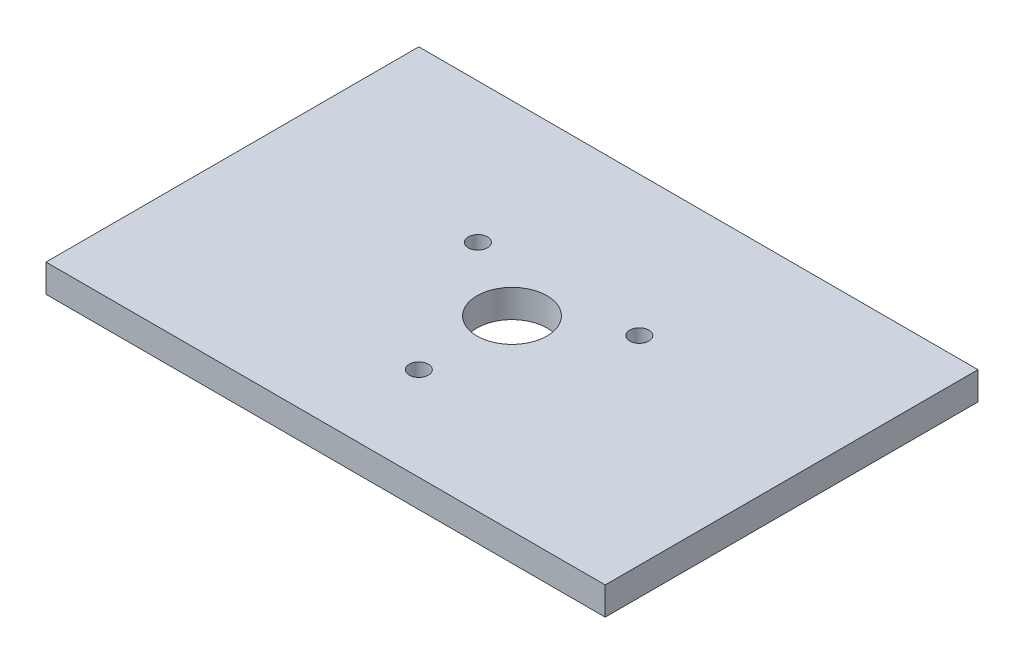
ISO-10303-21;
HEADER;
FILE_DESCRIPTION(('STEP AP214'),'2;1');
FILE_NAME('part.step','',(''),(''),'','','');
FILE_SCHEMA(('AUTOMOTIVE_DESIGN { 1 0 10303 214 1 1 1 1 }'));
ENDSEC;
DATA;
#1=APPLICATION_CONTEXT('core data for automotive mechanical design processes');
#2=APPLICATION_PROTOCOL_DEFINITION('international standard','automotive_design',2000,#1);
#3=PRODUCT_CONTEXT('',#1,'mechanical');
#4=PRODUCT('Part','Part','',(#3));
#5=PRODUCT_RELATED_PRODUCT_CATEGORY('part','',(#4));
#6=PRODUCT_DEFINITION_FORMATION('','',#4);
#7=PRODUCT_DEFINITION_CONTEXT('part definition',#1,'design');
#8=PRODUCT_DEFINITION('design','',#6,#7);
#9=PRODUCT_DEFINITION_SHAPE('','',#8);
#10=(LENGTH_UNIT() NAMED_UNIT(*) SI_UNIT(.MILLI.,.METRE.));
#11=(NAMED_UNIT(*) PLANE_ANGLE_UNIT() SI_UNIT($,.RADIAN.));
#12=(NAMED_UNIT(*) SI_UNIT($,.STERADIAN.) SOLID_ANGLE_UNIT());
#13=UNCERTAINTY_MEASURE_WITH_UNIT(LENGTH_MEASURE(1.E-05),#10,'distance_accuracy_value','');
#14=(GEOMETRIC_REPRESENTATION_CONTEXT(3) GLOBAL_UNCERTAINTY_ASSIGNED_CONTEXT((#13)) GLOBAL_UNIT_ASSIGNED_CONTEXT((#10,
#11,#12)) REPRESENTATION_CONTEXT('',''));
#15=CARTESIAN_POINT('',(0.,0.,0.));
#16=DIRECTION('',(0.,0.,1.));
#17=DIRECTION('',(1.,0.,0.));
#18=AXIS2_PLACEMENT_3D('',#15,#16,#17);
#19=CARTESIAN_POINT('',(60.,6.,-40.));
#20=DIRECTION('',(-1.,0.,0.));
#21=DIRECTION('',(0.,0.,1.));
#22=AXIS2_PLACEMENT_3D('',#19,#20,#21);
#23=PLANE('',#22);
#24=DIRECTION('',(0.,0.,-1.));
#25=VECTOR('',#24,1.);
#26=CARTESIAN_POINT('',(60.,0.,-40.));
#27=LINE('',#26,#25);
#28=CARTESIAN_POINT('',(60.,0.,40.));
#29=VERTEX_POINT('',#28);
#30=CARTESIAN_POINT('',(60.,0.,-40.));
#31=VERTEX_POINT('',#30);
#32=EDGE_CURVE('E101',#29,#31,#27,.T.);
#33=ORIENTED_EDGE('',*,*,#32,.T.);
#34=DIRECTION('',(0.,-1.,0.));
#35=VECTOR('',#34,1.);
#36=CARTESIAN_POINT('',(60.,6.,-40.));
#37=LINE('',#36,#35);
#38=CARTESIAN_POINT('',(60.,6.,-40.));
#39=VERTEX_POINT('',#38);
#40=EDGE_CURVE('E11',#39,#31,#37,.T.);
#41=ORIENTED_EDGE('',*,*,#40,.F.);
#42=DIRECTION('',(0.,0.,-1.));
#43=VECTOR('',#42,1.);
#44=CARTESIAN_POINT('',(60.,6.,-40.));
#45=LINE('',#44,#43);
#46=CARTESIAN_POINT('',(60.,6.,40.));
#47=VERTEX_POINT('',#46);
#48=EDGE_CURVE('E88',#47,#39,#45,.T.);
#49=ORIENTED_EDGE('',*,*,#48,.F.);
#50=DIRECTION('',(0.,-1.,0.));
#51=VECTOR('',#50,1.);
#52=CARTESIAN_POINT('',(60.,6.,40.));
#53=LINE('',#52,#51);
#54=EDGE_CURVE('E97',#47,#29,#53,.T.);
#55=ORIENTED_EDGE('',*,*,#54,.T.);
#56=EDGE_LOOP('',(#33,#41,#49,#55));
#57=FACE_BOUND('',#56,.T.);
#58=ADVANCED_FACE('F35',(#57),#23,.F.);
#59=CARTESIAN_POINT('',(-60.,6.,-40.));
#60=DIRECTION('',(0.,0.,1.));
#61=DIRECTION('',(1.,0.,0.));
#62=AXIS2_PLACEMENT_3D('',#59,#60,#61);
#63=PLANE('',#62);
#64=DIRECTION('',(-1.,0.,0.));
#65=VECTOR('',#64,1.);
#66=CARTESIAN_POINT('',(-60.,0.,-40.));
#67=LINE('',#66,#65);
#68=CARTESIAN_POINT('',(-60.,0.,-40.));
#69=VERTEX_POINT('',#68);
#70=EDGE_CURVE('E92',#31,#69,#67,.T.);
#71=ORIENTED_EDGE('',*,*,#70,.T.);
#72=DIRECTION('',(0.,-1.,0.));
#73=VECTOR('',#72,1.);
#74=CARTESIAN_POINT('',(-60.,6.,-40.));
#75=LINE('',#74,#73);
#76=CARTESIAN_POINT('',(-60.,6.,-40.));
#77=VERTEX_POINT('',#76);
#78=EDGE_CURVE('E44',#77,#69,#75,.T.);
#79=ORIENTED_EDGE('',*,*,#78,.F.);
#80=DIRECTION('',(-1.,0.,0.));
#81=VECTOR('',#80,1.);
#82=CARTESIAN_POINT('',(-60.,6.,-40.));
#83=LINE('',#82,#81);
#84=EDGE_CURVE('E83',#39,#77,#83,.T.);
#85=ORIENTED_EDGE('',*,*,#84,.F.);
#86=ORIENTED_EDGE('',*,*,#40,.T.);
#87=EDGE_LOOP('',(#71,#79,#85,#86));
#88=FACE_BOUND('',#87,.T.);
#89=ADVANCED_FACE('F91',(#88),#63,.F.);
#90=CARTESIAN_POINT('',(-60.,6.,-40.));
#91=DIRECTION('',(1.,0.,0.));
#92=DIRECTION('',(0.,0.,-1.));
#93=AXIS2_PLACEMENT_3D('',#90,#91,#92);
#94=PLANE('',#93);
#95=DIRECTION('',(0.,0.,1.));
#96=VECTOR('',#95,1.);
#97=CARTESIAN_POINT('',(-60.,0.,-40.));
#98=LINE('',#97,#96);
#99=CARTESIAN_POINT('',(-60.,0.,40.));
#100=VERTEX_POINT('',#99);
#101=EDGE_CURVE('E70',#69,#100,#98,.T.);
#102=ORIENTED_EDGE('',*,*,#101,.T.);
#103=DIRECTION('',(0.,-1.,0.));
#104=VECTOR('',#103,1.);
#105=CARTESIAN_POINT('',(-60.,6.,40.));
#106=LINE('',#105,#104);
#107=CARTESIAN_POINT('',(-60.,6.,40.));
#108=VERTEX_POINT('',#107);
#109=EDGE_CURVE('E93',#108,#100,#106,.T.);
#110=ORIENTED_EDGE('',*,*,#109,.F.);
#111=DIRECTION('',(0.,0.,1.));
#112=VECTOR('',#111,1.);
#113=CARTESIAN_POINT('',(-60.,6.,-40.));
#114=LINE('',#113,#112);
#115=EDGE_CURVE('E86',#77,#108,#114,.T.);
#116=ORIENTED_EDGE('',*,*,#115,.F.);
#117=ORIENTED_EDGE('',*,*,#78,.T.);
#118=EDGE_LOOP('',(#102,#110,#116,#117));
#119=FACE_BOUND('',#118,.T.);
#120=ADVANCED_FACE('F95',(#119),#94,.F.);
#121=CARTESIAN_POINT('',(-60.,6.,40.));
#122=DIRECTION('',(0.,0.,-1.));
#123=DIRECTION('',(-1.,0.,0.));
#124=AXIS2_PLACEMENT_3D('',#121,#122,#123);
#125=PLANE('',#124);
#126=DIRECTION('',(1.,0.,0.));
#127=VECTOR('',#126,1.);
#128=CARTESIAN_POINT('',(-60.,0.,40.));
#129=LINE('',#128,#127);
#130=EDGE_CURVE('E76',#100,#29,#129,.T.);
#131=ORIENTED_EDGE('',*,*,#130,.T.);
#132=ORIENTED_EDGE('',*,*,#54,.F.);
#133=DIRECTION('',(1.,0.,0.));
#134=VECTOR('',#133,1.);
#135=CARTESIAN_POINT('',(-60.,6.,40.));
#136=LINE('',#135,#134);
#137=EDGE_CURVE('E53',#108,#47,#136,.T.);
#138=ORIENTED_EDGE('',*,*,#137,.F.);
#139=ORIENTED_EDGE('',*,*,#109,.T.);
#140=EDGE_LOOP('',(#131,#132,#138,#139));
#141=FACE_BOUND('',#140,.T.);
#142=ADVANCED_FACE('F165',(#141),#125,.F.);
#143=CARTESIAN_POINT('',(0.,6.,0.));
#144=DIRECTION('',(0.,1.,0.));
#145=DIRECTION('',(0.,0.,1.));
#146=AXIS2_PLACEMENT_3D('',#143,#144,#145);
#147=PLANE('',#146);
#148=CARTESIAN_POINT('',(0.,6.,0.));
#149=DIRECTION('',(0.,1.,0.));
#150=DIRECTION('',(0.,0.,1.));
#151=AXIS2_PLACEMENT_3D('',#148,#149,#150);
#152=CIRCLE('',#151,7.5);
#153=CARTESIAN_POINT('',(0.,6.,7.5));
#154=VERTEX_POINT('',#153);
#155=EDGE_CURVE('E398',#154,#154,#152,.T.);
#156=ORIENTED_EDGE('',*,*,#155,.F.);
#157=EDGE_LOOP('',(#156));
#158=FACE_BOUND('',#157,.T.);
#159=CARTESIAN_POINT('',(17.3205080756889,6.,-9.99999999999984));
#160=DIRECTION('',(0.,1.,0.));
#161=DIRECTION('',(0.,0.,1.));
#162=AXIS2_PLACEMENT_3D('',#159,#160,#161);
#163=CIRCLE('',#162,2.05);
#164=CARTESIAN_POINT('',(17.3205080756889,6.,-7.94999999999984));
#165=VERTEX_POINT('',#164);
#166=EDGE_CURVE('E143',#165,#165,#163,.T.);
#167=ORIENTED_EDGE('',*,*,#166,.F.);
#168=EDGE_LOOP('',(#167));
#169=FACE_BOUND('',#168,.T.);
#170=CARTESIAN_POINT('',(-17.3205080756887,6.,-10.0000000000001));
#171=DIRECTION('',(0.,1.,0.));
#172=DIRECTION('',(0.,0.,1.));
#173=AXIS2_PLACEMENT_3D('',#170,#171,#172);
#174=CIRCLE('',#173,2.05);
#175=CARTESIAN_POINT('',(-17.3205080756887,6.,-7.95000000000008));
#176=VERTEX_POINT('',#175);
#177=EDGE_CURVE('E147',#176,#176,#174,.T.);
#178=ORIENTED_EDGE('',*,*,#177,.F.);
#179=EDGE_LOOP('',(#178));
#180=FACE_BOUND('',#179,.T.);
#181=CARTESIAN_POINT('',(0.,6.,20.));
#182=DIRECTION('',(0.,1.,0.));
#183=DIRECTION('',(0.,0.,1.));
#184=AXIS2_PLACEMENT_3D('',#181,#182,#183);
#185=CIRCLE('',#184,2.05);
#186=CARTESIAN_POINT('',(0.,6.,22.05));
#187=VERTEX_POINT('',#186);
#188=EDGE_CURVE('E153',#187,#187,#185,.T.);
#189=ORIENTED_EDGE('',*,*,#188,.F.);
#190=EDGE_LOOP('',(#189));
#191=FACE_BOUND('',#190,.T.);
#192=ORIENTED_EDGE('',*,*,#48,.T.);
#193=ORIENTED_EDGE('',*,*,#84,.T.);
#194=ORIENTED_EDGE('',*,*,#115,.T.);
#195=ORIENTED_EDGE('',*,*,#137,.T.);
#196=EDGE_LOOP('',(#192,#193,#194,#195));
#197=FACE_BOUND('',#196,.T.);
#198=ADVANCED_FACE('F84',(#158,#169,#180,#191,#197),#147,.T.);
#199=CARTESIAN_POINT('',(0.,0.,0.));
#200=DIRECTION('',(0.,1.,0.));
#201=DIRECTION('',(0.,0.,1.));
#202=AXIS2_PLACEMENT_3D('',#199,#200,#201);
#203=PLANE('',#202);
#204=CARTESIAN_POINT('',(0.,0.,0.));
#205=DIRECTION('',(0.,-1.,0.));
#206=DIRECTION('',(0.,0.,-1.));
#207=AXIS2_PLACEMENT_3D('',#204,#205,#206);
#208=CIRCLE('',#207,7.5);
#209=CARTESIAN_POINT('',(0.,0.,-7.5));
#210=VERTEX_POINT('',#209);
#211=EDGE_CURVE('E401',#210,#210,#208,.T.);
#212=ORIENTED_EDGE('',*,*,#211,.F.);
#213=EDGE_LOOP('',(#212));
#214=FACE_BOUND('',#213,.T.);
#215=CARTESIAN_POINT('',(1.23317027271744E-12,0.,-18.9999999999993));
#216=DIRECTION('',(0.,-1.,0.));
#217=DIRECTION('',(0.,0.,-1.));
#218=AXIS2_PLACEMENT_3D('',#215,#216,#217);
#219=CIRCLE('',#218,4.00000000000055);
#220=CARTESIAN_POINT('',(1.23317027271744E-12,0.,-22.9999999999999));
#221=VERTEX_POINT('',#220);
#222=EDGE_CURVE('E130',#221,#221,#219,.T.);
#223=ORIENTED_EDGE('',*,*,#222,.F.);
#224=EDGE_LOOP('',(#223));
#225=FACE_BOUND('',#224,.T.);
#226=CARTESIAN_POINT('',(16.4544826719043,0.,9.50000000000142));
#227=DIRECTION('',(0.,-1.,0.));
#228=DIRECTION('',(0.,0.,-1.));
#229=AXIS2_PLACEMENT_3D('',#226,#227,#228);
#230=CIRCLE('',#229,4.00000000000143);
#231=CARTESIAN_POINT('',(16.4544826719043,0.,5.49999999999998));
#232=VERTEX_POINT('',#231);
#233=EDGE_CURVE('E123',#232,#232,#230,.T.);
#234=ORIENTED_EDGE('',*,*,#233,.F.);
#235=EDGE_LOOP('',(#234));
#236=FACE_BOUND('',#235,.T.);
#237=CARTESIAN_POINT('',(-16.4544826719043,0.,9.49999999999999));
#238=DIRECTION('',(0.,-1.,0.));
#239=DIRECTION('',(0.,0.,-1.));
#240=AXIS2_PLACEMENT_3D('',#237,#238,#239);
#241=CIRCLE('',#240,4.);
#242=CARTESIAN_POINT('',(-16.4544826719043,0.,5.49999999999999));
#243=VERTEX_POINT('',#242);
#244=EDGE_CURVE('E116',#243,#243,#241,.T.);
#245=ORIENTED_EDGE('',*,*,#244,.F.);
#246=EDGE_LOOP('',(#245));
#247=FACE_BOUND('',#246,.T.);
#248=ORIENTED_EDGE('',*,*,#32,.F.);
#249=ORIENTED_EDGE('',*,*,#130,.F.);
#250=ORIENTED_EDGE('',*,*,#101,.F.);
#251=ORIENTED_EDGE('',*,*,#70,.F.);
#252=EDGE_LOOP('',(#248,#249,#250,#251));
#253=FACE_BOUND('',#252,.T.);
#254=ADVANCED_FACE('F164',(#214,#225,#236,#247,#253),#203,.F.);
#255=CARTESIAN_POINT('',(0.,1.,20.));
#256=DIRECTION('',(0.,1.,0.));
#257=DIRECTION('',(0.,0.,1.));
#258=AXIS2_PLACEMENT_3D('',#255,#256,#257);
#259=CYLINDRICAL_SURFACE('',#258,2.05);
#260=CARTESIAN_POINT('',(0.,1.,20.));
#261=DIRECTION('',(0.,1.,0.));
#262=DIRECTION('',(0.,0.,1.));
#263=AXIS2_PLACEMENT_3D('',#260,#261,#262);
#264=CIRCLE('',#263,2.05);
#265=CARTESIAN_POINT('',(0.,1.,22.05));
#266=VERTEX_POINT('',#265);
#267=EDGE_CURVE('E104',#266,#266,#264,.T.);
#268=ORIENTED_EDGE('',*,*,#267,.F.);
#269=EDGE_LOOP('',(#268));
#270=FACE_BOUND('',#269,.T.);
#271=ORIENTED_EDGE('',*,*,#188,.T.);
#272=EDGE_LOOP('',(#271));
#273=FACE_BOUND('',#272,.T.);
#274=ADVANCED_FACE('F161',(#270,#273),#259,.F.);
#275=CARTESIAN_POINT('',(0.,1.,20.));
#276=DIRECTION('',(0.,1.,0.));
#277=DIRECTION('',(0.,0.,1.));
#278=AXIS2_PLACEMENT_3D('',#275,#276,#277);
#279=PLANE('',#278);
#280=ORIENTED_EDGE('',*,*,#267,.T.);
#281=EDGE_LOOP('',(#280));
#282=FACE_BOUND('',#281,.T.);
#283=ADVANCED_FACE('F205',(#282),#279,.T.);
#284=CARTESIAN_POINT('',(-17.3205080756887,1.,-10.0000000000001));
#285=DIRECTION('',(0.,1.,0.));
#286=DIRECTION('',(0.,0.,1.));
#287=AXIS2_PLACEMENT_3D('',#284,#285,#286);
#288=CYLINDRICAL_SURFACE('',#287,2.05);
#289=CARTESIAN_POINT('',(-17.3205080756887,1.,-10.0000000000001));
#290=DIRECTION('',(0.,1.,0.));
#291=DIRECTION('',(0.,0.,1.));
#292=AXIS2_PLACEMENT_3D('',#289,#290,#291);
#293=CIRCLE('',#292,2.05);
#294=CARTESIAN_POINT('',(-17.3205080756887,1.,-7.95000000000008));
#295=VERTEX_POINT('',#294);
#296=EDGE_CURVE('E150',#295,#295,#293,.T.);
#297=ORIENTED_EDGE('',*,*,#296,.F.);
#298=EDGE_LOOP('',(#297));
#299=FACE_BOUND('',#298,.T.);
#300=ORIENTED_EDGE('',*,*,#177,.T.);
#301=EDGE_LOOP('',(#300));
#302=FACE_BOUND('',#301,.T.);
#303=ADVANCED_FACE('F215',(#299,#302),#288,.F.);
#304=CARTESIAN_POINT('',(-17.3205080756887,1.,-10.0000000000001));
#305=DIRECTION('',(0.,1.,0.));
#306=DIRECTION('',(0.,0.,1.));
#307=AXIS2_PLACEMENT_3D('',#304,#305,#306);
#308=PLANE('',#307);
#309=ORIENTED_EDGE('',*,*,#296,.T.);
#310=EDGE_LOOP('',(#309));
#311=FACE_BOUND('',#310,.T.);
#312=ADVANCED_FACE('F225',(#311),#308,.T.);
#313=CARTESIAN_POINT('',(17.3205080756889,1.,-9.99999999999984));
#314=DIRECTION('',(0.,1.,0.));
#315=DIRECTION('',(0.,0.,1.));
#316=AXIS2_PLACEMENT_3D('',#313,#314,#315);
#317=CYLINDRICAL_SURFACE('',#316,2.05);
#318=CARTESIAN_POINT('',(17.3205080756889,1.,-9.99999999999984));
#319=DIRECTION('',(0.,1.,0.));
#320=DIRECTION('',(0.,0.,1.));
#321=AXIS2_PLACEMENT_3D('',#318,#319,#320);
#322=CIRCLE('',#321,2.05);
#323=CARTESIAN_POINT('',(17.3205080756889,1.,-7.94999999999984));
#324=VERTEX_POINT('',#323);
#325=EDGE_CURVE('E144',#324,#324,#322,.T.);
#326=ORIENTED_EDGE('',*,*,#325,.F.);
#327=EDGE_LOOP('',(#326));
#328=FACE_BOUND('',#327,.T.);
#329=ORIENTED_EDGE('',*,*,#166,.T.);
#330=EDGE_LOOP('',(#329));
#331=FACE_BOUND('',#330,.T.);
#332=ADVANCED_FACE('F235',(#328,#331),#317,.F.);
#333=CARTESIAN_POINT('',(17.3205080756889,1.,-9.99999999999984));
#334=DIRECTION('',(0.,1.,0.));
#335=DIRECTION('',(0.,0.,1.));
#336=AXIS2_PLACEMENT_3D('',#333,#334,#335);
#337=PLANE('',#336);
#338=ORIENTED_EDGE('',*,*,#325,.T.);
#339=EDGE_LOOP('',(#338));
#340=FACE_BOUND('',#339,.T.);
#341=ADVANCED_FACE('F245',(#340),#337,.T.);
#342=CARTESIAN_POINT('',(-16.4544826719043,3.,9.49999999999999));
#343=DIRECTION('',(0.,-1.,0.));
#344=DIRECTION('',(0.,0.,-1.));
#345=AXIS2_PLACEMENT_3D('',#342,#343,#344);
#346=PLANE('',#345);
#347=CARTESIAN_POINT('',(-16.4544826719043,3.,9.49999999999999));
#348=DIRECTION('',(0.,-1.,0.));
#349=DIRECTION('',(0.,0.,-1.));
#350=AXIS2_PLACEMENT_3D('',#347,#348,#349);
#351=CIRCLE('',#350,4.);
#352=CARTESIAN_POINT('',(-16.4544826719043,3.,5.49999999999999));
#353=VERTEX_POINT('',#352);
#354=EDGE_CURVE('E113',#353,#353,#351,.T.);
#355=ORIENTED_EDGE('',*,*,#354,.T.);
#356=EDGE_LOOP('',(#355));
#357=FACE_BOUND('',#356,.T.);
#358=CARTESIAN_POINT('',(-16.4544826719043,3.,9.49999999999999));
#359=DIRECTION('',(0.,-1.,0.));
#360=DIRECTION('',(0.,0.,-1.));
#361=AXIS2_PLACEMENT_3D('',#358,#359,#360);
#362=CIRCLE('',#361,2.05);
#363=CARTESIAN_POINT('',(-16.4544826719043,3.,7.44999999999999));
#364=VERTEX_POINT('',#363);
#365=EDGE_CURVE('E110',#364,#364,#362,.F.);
#366=ORIENTED_EDGE('',*,*,#365,.T.);
#367=EDGE_LOOP('',(#366));
#368=FACE_BOUND('',#367,.T.);
#369=ADVANCED_FACE('F255',(#357,#368),#346,.T.);
#370=CARTESIAN_POINT('',(-16.4544826719043,3.,9.49999999999999));
#371=DIRECTION('',(0.,-1.,0.));
#372=DIRECTION('',(0.,0.,-1.));
#373=AXIS2_PLACEMENT_3D('',#370,#371,#372);
#374=CYLINDRICAL_SURFACE('',#373,4.);
#375=ORIENTED_EDGE('',*,*,#354,.F.);
#376=EDGE_LOOP('',(#375));
#377=FACE_BOUND('',#376,.T.);
#378=ORIENTED_EDGE('',*,*,#244,.T.);
#379=EDGE_LOOP('',(#378));
#380=FACE_BOUND('',#379,.T.);
#381=ADVANCED_FACE('F282',(#377,#380),#374,.F.);
#382=CARTESIAN_POINT('',(0.,5.,0.));
#383=DIRECTION('',(0.,-1.,0.));
#384=DIRECTION('',(0.,0.,-1.));
#385=AXIS2_PLACEMENT_3D('',#382,#383,#384);
#386=PLANE('',#385);
#387=CARTESIAN_POINT('',(-16.4544826719043,5.,9.49999999999999));
#388=DIRECTION('',(0.,-1.,0.));
#389=DIRECTION('',(0.,0.,-1.));
#390=AXIS2_PLACEMENT_3D('',#387,#388,#389);
#391=CIRCLE('',#390,2.05);
#392=CARTESIAN_POINT('',(-16.4544826719043,5.,7.44999999999999));
#393=VERTEX_POINT('',#392);
#394=EDGE_CURVE('E137',#393,#393,#391,.T.);
#395=ORIENTED_EDGE('',*,*,#394,.T.);
#396=EDGE_LOOP('',(#395));
#397=FACE_BOUND('',#396,.T.);
#398=ADVANCED_FACE('F277',(#397),#386,.T.);
#399=CARTESIAN_POINT('',(-16.4544826719043,5.,9.49999999999999));
#400=DIRECTION('',(0.,-1.,0.));
#401=DIRECTION('',(0.,0.,-1.));
#402=AXIS2_PLACEMENT_3D('',#399,#400,#401);
#403=CYLINDRICAL_SURFACE('',#402,2.05);
#404=ORIENTED_EDGE('',*,*,#394,.F.);
#405=EDGE_LOOP('',(#404));
#406=FACE_BOUND('',#405,.T.);
#407=ORIENTED_EDGE('',*,*,#365,.F.);
#408=EDGE_LOOP('',(#407));
#409=FACE_BOUND('',#408,.T.);
#410=ADVANCED_FACE('F281',(#406,#409),#403,.F.);
#411=CARTESIAN_POINT('',(16.4544826719043,3.,9.50000000000142));
#412=DIRECTION('',(0.,-1.,0.));
#413=DIRECTION('',(0.,0.,-1.));
#414=AXIS2_PLACEMENT_3D('',#411,#412,#413);
#415=PLANE('',#414);
#416=CARTESIAN_POINT('',(16.4544826719043,3.,9.50000000000142));
#417=DIRECTION('',(0.,-1.,0.));
#418=DIRECTION('',(0.,0.,-1.));
#419=AXIS2_PLACEMENT_3D('',#416,#417,#418);
#420=CIRCLE('',#419,4.00000000000143);
#421=CARTESIAN_POINT('',(16.4544826719043,3.,5.49999999999998));
#422=VERTEX_POINT('',#421);
#423=EDGE_CURVE('E117',#422,#422,#420,.T.);
#424=ORIENTED_EDGE('',*,*,#423,.T.);
#425=EDGE_LOOP('',(#424));
#426=FACE_BOUND('',#425,.T.);
#427=CARTESIAN_POINT('',(16.4544826719043,3.,9.50000000000141));
#428=DIRECTION('',(0.,-1.,0.));
#429=DIRECTION('',(0.,0.,-1.));
#430=AXIS2_PLACEMENT_3D('',#427,#428,#429);
#431=CIRCLE('',#430,2.05000000000143);
#432=CARTESIAN_POINT('',(16.4544826719043,3.,7.44999999999998));
#433=VERTEX_POINT('',#432);
#434=EDGE_CURVE('E114',#433,#433,#431,.F.);
#435=ORIENTED_EDGE('',*,*,#434,.T.);
#436=EDGE_LOOP('',(#435));
#437=FACE_BOUND('',#436,.T.);
#438=ADVANCED_FACE('F325',(#426,#437),#415,.T.);
#439=CARTESIAN_POINT('',(16.4544826719043,3.,9.50000000000142));
#440=DIRECTION('',(0.,-1.,0.));
#441=DIRECTION('',(0.,0.,-1.));
#442=AXIS2_PLACEMENT_3D('',#439,#440,#441);
#443=CYLINDRICAL_SURFACE('',#442,4.00000000000143);
#444=ORIENTED_EDGE('',*,*,#423,.F.);
#445=EDGE_LOOP('',(#444));
#446=FACE_BOUND('',#445,.T.);
#447=ORIENTED_EDGE('',*,*,#233,.T.);
#448=EDGE_LOOP('',(#447));
#449=FACE_BOUND('',#448,.T.);
#450=ADVANCED_FACE('F268',(#446,#449),#443,.F.);
#451=CARTESIAN_POINT('',(0.,5.,0.));
#452=DIRECTION('',(0.,-1.,0.));
#453=DIRECTION('',(0.,0.,-1.));
#454=AXIS2_PLACEMENT_3D('',#451,#452,#453);
#455=PLANE('',#454);
#456=CARTESIAN_POINT('',(16.4544826719043,5.,9.50000000000141));
#457=DIRECTION('',(0.,-1.,0.));
#458=DIRECTION('',(0.,0.,-1.));
#459=AXIS2_PLACEMENT_3D('',#456,#457,#458);
#460=CIRCLE('',#459,2.05000000000143);
#461=CARTESIAN_POINT('',(16.4544826719043,5.,7.44999999999998));
#462=VERTEX_POINT('',#461);
#463=EDGE_CURVE('E140',#462,#462,#460,.T.);
#464=ORIENTED_EDGE('',*,*,#463,.T.);
#465=EDGE_LOOP('',(#464));
#466=FACE_BOUND('',#465,.T.);
#467=ADVANCED_FACE('F263',(#466),#455,.T.);
#468=CARTESIAN_POINT('',(16.4544826719043,5.,9.50000000000141));
#469=DIRECTION('',(0.,-1.,0.));
#470=DIRECTION('',(0.,0.,-1.));
#471=AXIS2_PLACEMENT_3D('',#468,#469,#470);
#472=CYLINDRICAL_SURFACE('',#471,2.05000000000143);
#473=ORIENTED_EDGE('',*,*,#463,.F.);
#474=EDGE_LOOP('',(#473));
#475=FACE_BOUND('',#474,.T.);
#476=ORIENTED_EDGE('',*,*,#434,.F.);
#477=EDGE_LOOP('',(#476));
#478=FACE_BOUND('',#477,.T.);
#479=ADVANCED_FACE('F267',(#475,#478),#472,.F.);
#480=CARTESIAN_POINT('',(1.23317027271744E-12,3.,-18.9999999999993));
#481=DIRECTION('',(0.,-1.,0.));
#482=DIRECTION('',(0.,0.,-1.));
#483=AXIS2_PLACEMENT_3D('',#480,#481,#482);
#484=PLANE('',#483);
#485=CARTESIAN_POINT('',(1.23317027271744E-12,3.,-18.9999999999993));
#486=DIRECTION('',(0.,-1.,0.));
#487=DIRECTION('',(0.,0.,-1.));
#488=AXIS2_PLACEMENT_3D('',#485,#486,#487);
#489=CIRCLE('',#488,4.00000000000055);
#490=CARTESIAN_POINT('',(1.23317027271744E-12,3.,-22.9999999999999));
#491=VERTEX_POINT('',#490);
#492=EDGE_CURVE('E404',#491,#491,#489,.T.);
#493=ORIENTED_EDGE('',*,*,#492,.T.);
#494=EDGE_LOOP('',(#493));
#495=FACE_BOUND('',#494,.T.);
#496=CARTESIAN_POINT('',(1.23143554924146E-12,3.,-18.9999999999993));
#497=DIRECTION('',(0.,-1.,0.));
#498=DIRECTION('',(0.,0.,-1.));
#499=AXIS2_PLACEMENT_3D('',#496,#497,#498);
#500=CIRCLE('',#499,2.05000000000054);
#501=CARTESIAN_POINT('',(1.23143554924146E-12,3.,-21.0499999999998));
#502=VERTEX_POINT('',#501);
#503=EDGE_CURVE('E38',#502,#502,#500,.F.);
#504=ORIENTED_EDGE('',*,*,#503,.T.);
#505=EDGE_LOOP('',(#504));
#506=FACE_BOUND('',#505,.T.);
#507=ADVANCED_FACE('F350',(#495,#506),#484,.T.);
#508=CARTESIAN_POINT('',(1.23317027271744E-12,3.,-18.9999999999993));
#509=DIRECTION('',(0.,-1.,0.));
#510=DIRECTION('',(0.,0.,-1.));
#511=AXIS2_PLACEMENT_3D('',#508,#509,#510);
#512=CYLINDRICAL_SURFACE('',#511,4.00000000000055);
#513=ORIENTED_EDGE('',*,*,#492,.F.);
#514=EDGE_LOOP('',(#513));
#515=FACE_BOUND('',#514,.T.);
#516=ORIENTED_EDGE('',*,*,#222,.T.);
#517=EDGE_LOOP('',(#516));
#518=FACE_BOUND('',#517,.T.);
#519=ADVANCED_FACE('F296',(#515,#518),#512,.F.);
#520=CARTESIAN_POINT('',(0.,5.,0.));
#521=DIRECTION('',(0.,-1.,0.));
#522=DIRECTION('',(0.,0.,-1.));
#523=AXIS2_PLACEMENT_3D('',#520,#521,#522);
#524=PLANE('',#523);
#525=CARTESIAN_POINT('',(1.23143554924146E-12,5.,-18.9999999999993));
#526=DIRECTION('',(0.,-1.,0.));
#527=DIRECTION('',(0.,0.,-1.));
#528=AXIS2_PLACEMENT_3D('',#525,#526,#527);
#529=CIRCLE('',#528,2.05000000000054);
#530=CARTESIAN_POINT('',(1.23143554924146E-12,5.,-21.0499999999998));
#531=VERTEX_POINT('',#530);
#532=EDGE_CURVE('E112',#531,#531,#529,.T.);
#533=ORIENTED_EDGE('',*,*,#532,.T.);
#534=EDGE_LOOP('',(#533));
#535=FACE_BOUND('',#534,.T.);
#536=ADVANCED_FACE('F291',(#535),#524,.T.);
#537=CARTESIAN_POINT('',(1.23143554924146E-12,5.,-18.9999999999993));
#538=DIRECTION('',(0.,-1.,0.));
#539=DIRECTION('',(0.,0.,-1.));
#540=AXIS2_PLACEMENT_3D('',#537,#538,#539);
#541=CYLINDRICAL_SURFACE('',#540,2.05000000000054);
#542=ORIENTED_EDGE('',*,*,#532,.F.);
#543=EDGE_LOOP('',(#542));
#544=FACE_BOUND('',#543,.T.);
#545=ORIENTED_EDGE('',*,*,#503,.F.);
#546=EDGE_LOOP('',(#545));
#547=FACE_BOUND('',#546,.T.);
#548=ADVANCED_FACE('F295',(#544,#547),#541,.F.);
#549=CARTESIAN_POINT('',(0.,10.,0.));
#550=DIRECTION('',(0.,-1.,0.));
#551=DIRECTION('',(0.,0.,-1.));
#552=AXIS2_PLACEMENT_3D('',#549,#550,#551);
#553=CYLINDRICAL_SURFACE('',#552,7.5);
#554=ORIENTED_EDGE('',*,*,#155,.T.);
#555=EDGE_LOOP('',(#554));
#556=FACE_BOUND('',#555,.T.);
#557=ORIENTED_EDGE('',*,*,#211,.T.);
#558=EDGE_LOOP('',(#557));
#559=FACE_BOUND('',#558,.T.);
#560=ADVANCED_FACE('F374',(#556,#559),#553,.F.);
#561=CLOSED_SHELL('',(#58,#89,#120,#142,#198,#254,#274,#283,#303,#312,#332,#341,#369,#381,#398,
#410,#438,#450,#467,#479,#507,#519,#536,#548,#560));
#562=MANIFOLD_SOLID_BREP('B2',#561);
#563=ADVANCED_BREP_SHAPE_REPRESENTATION('',(#18,#562),#14);
#564=SHAPE_DEFINITION_REPRESENTATION(#9,#563);
ENDSEC;
END-ISO-10303-21;
